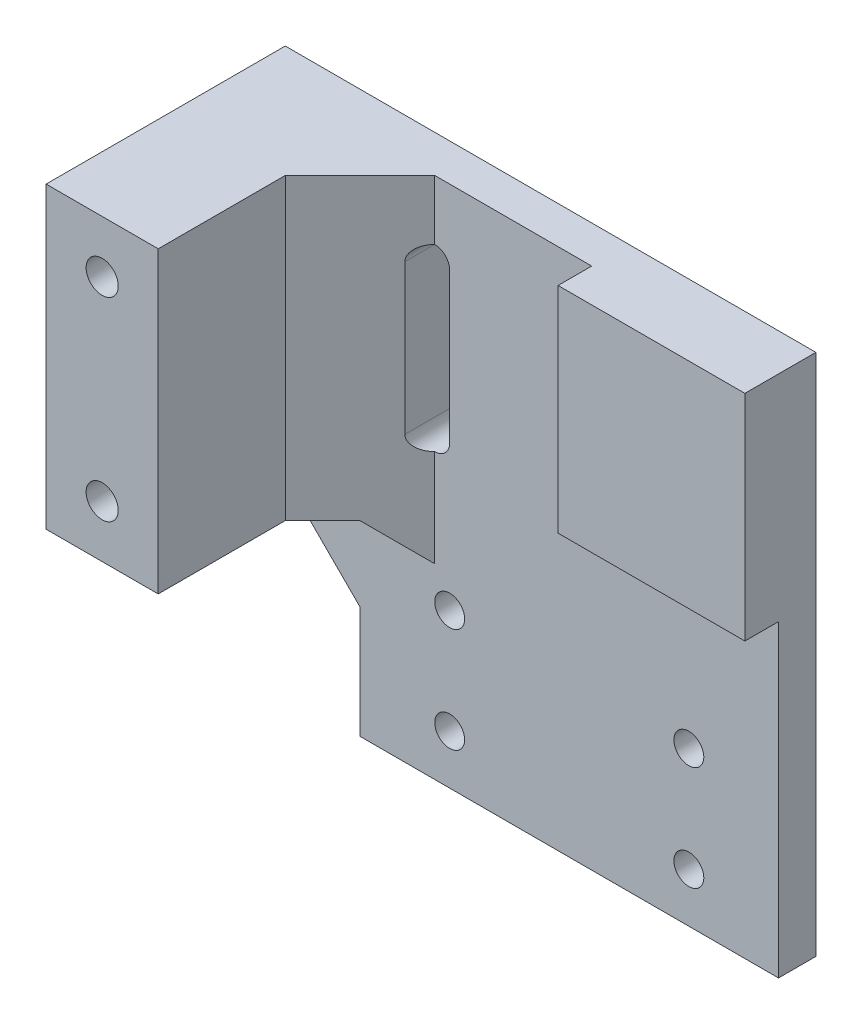
ISO-10303-21;
HEADER;
FILE_DESCRIPTION(('STEP AP214'),'2;1');
FILE_NAME('part.step','',(''),(''),'','','');
FILE_SCHEMA(('AUTOMOTIVE_DESIGN { 1 0 10303 214 1 1 1 1 }'));
ENDSEC;
DATA;
#1=APPLICATION_CONTEXT('core data for automotive mechanical design processes');
#2=APPLICATION_PROTOCOL_DEFINITION('international standard','automotive_design',2000,#1);
#3=PRODUCT_CONTEXT('',#1,'mechanical');
#4=PRODUCT('Part','Part','',(#3));
#5=PRODUCT_RELATED_PRODUCT_CATEGORY('part','',(#4));
#6=PRODUCT_DEFINITION_FORMATION('','',#4);
#7=PRODUCT_DEFINITION_CONTEXT('part definition',#1,'design');
#8=PRODUCT_DEFINITION('design','',#6,#7);
#9=PRODUCT_DEFINITION_SHAPE('','',#8);
#10=(LENGTH_UNIT() NAMED_UNIT(*) SI_UNIT(.MILLI.,.METRE.));
#11=(NAMED_UNIT(*) PLANE_ANGLE_UNIT() SI_UNIT($,.RADIAN.));
#12=(NAMED_UNIT(*) SI_UNIT($,.STERADIAN.) SOLID_ANGLE_UNIT());
#13=UNCERTAINTY_MEASURE_WITH_UNIT(LENGTH_MEASURE(1.E-05),#10,'distance_accuracy_value','');
#14=(GEOMETRIC_REPRESENTATION_CONTEXT(3) GLOBAL_UNCERTAINTY_ASSIGNED_CONTEXT((#13)) GLOBAL_UNIT_ASSIGNED_CONTEXT((#10,
#11,#12)) REPRESENTATION_CONTEXT('',''));
#15=CARTESIAN_POINT('',(0.,0.,0.));
#16=DIRECTION('',(0.,0.,1.));
#17=DIRECTION('',(1.,0.,0.));
#18=AXIS2_PLACEMENT_3D('',#15,#16,#17);
#19=CARTESIAN_POINT('',(-28.,-35.,5.));
#20=DIRECTION('',(1.,0.,0.));
#21=DIRECTION('',(0.,0.,-1.));
#22=AXIS2_PLACEMENT_3D('',#19,#20,#21);
#23=PLANE('',#22);
#24=DIRECTION('',(0.,-1.,0.));
#25=VECTOR('',#24,1.);
#26=CARTESIAN_POINT('',(-28.,-35.,5.));
#27=LINE('',#26,#25);
#28=CARTESIAN_POINT('',(-28.,-20.,5.));
#29=VERTEX_POINT('',#28);
#30=CARTESIAN_POINT('',(-28.,-35.,5.));
#31=VERTEX_POINT('',#30);
#32=EDGE_CURVE('E298',#29,#31,#27,.T.);
#33=ORIENTED_EDGE('',*,*,#32,.F.);
#34=DIRECTION('',(0.,0.,-1.));
#35=VECTOR('',#34,1.);
#36=CARTESIAN_POINT('',(-28.,-20.,0.));
#37=LINE('',#36,#35);
#38=CARTESIAN_POINT('',(-28.,-20.,0.));
#39=VERTEX_POINT('',#38);
#40=EDGE_CURVE('E341',#29,#39,#37,.T.);
#41=ORIENTED_EDGE('',*,*,#40,.T.);
#42=DIRECTION('',(0.,-1.,0.));
#43=VECTOR('',#42,1.);
#44=CARTESIAN_POINT('',(-28.,-35.,0.));
#45=LINE('',#44,#43);
#46=CARTESIAN_POINT('',(-28.,-35.,0.));
#47=VERTEX_POINT('',#46);
#48=EDGE_CURVE('E307',#39,#47,#45,.T.);
#49=ORIENTED_EDGE('',*,*,#48,.T.);
#50=DIRECTION('',(0.,0.,-1.));
#51=VECTOR('',#50,1.);
#52=CARTESIAN_POINT('',(-28.,-35.,5.));
#53=LINE('',#52,#51);
#54=EDGE_CURVE('E312',#31,#47,#53,.T.);
#55=ORIENTED_EDGE('',*,*,#54,.F.);
#56=EDGE_LOOP('',(#33,#41,#49,#55));
#57=FACE_BOUND('',#56,.T.);
#58=ADVANCED_FACE('F43',(#57),#23,.F.);
#59=CARTESIAN_POINT('',(0.,0.,5.));
#60=DIRECTION('',(0.,0.,-1.));
#61=DIRECTION('',(-1.,0.,0.));
#62=AXIS2_PLACEMENT_3D('',#59,#60,#61);
#63=PLANE('',#62);
#64=DIRECTION('',(0.,-1.,0.));
#65=VECTOR('',#64,1.);
#66=CARTESIAN_POINT('',(-17.9999999999998,-4.99999999999998,5.));
#67=LINE('',#66,#65);
#68=CARTESIAN_POINT('',(-17.9999999999998,3.,5.));
#69=VERTEX_POINT('',#68);
#70=CARTESIAN_POINT('',(-17.9999999999998,-10.,5.));
#71=VERTEX_POINT('',#70);
#72=EDGE_CURVE('E325',#69,#71,#67,.T.);
#73=ORIENTED_EDGE('',*,*,#72,.T.);
#74=DIRECTION('',(-1.,0.,0.));
#75=VECTOR('',#74,1.);
#76=CARTESIAN_POINT('',(-43.,-10.,5.));
#77=LINE('',#76,#75);
#78=CARTESIAN_POINT('',(-38.,-10.,5.));
#79=VERTEX_POINT('',#78);
#80=EDGE_CURVE('E347',#71,#79,#77,.T.);
#81=ORIENTED_EDGE('',*,*,#80,.T.);
#82=DIRECTION('',(-0.707106781186551,0.707106781186544,0.));
#83=VECTOR('',#82,1.);
#84=CARTESIAN_POINT('',(-23.9999999999998,-24.0000000000001,5.));
#85=LINE('',#84,#83);
#86=EDGE_CURVE('E343',#79,#29,#85,.F.);
#87=ORIENTED_EDGE('',*,*,#86,.T.);
#88=ORIENTED_EDGE('',*,*,#32,.T.);
#89=DIRECTION('',(1.,0.,0.));
#90=VECTOR('',#89,1.);
#91=CARTESIAN_POINT('',(-28.,-35.,5.));
#92=LINE('',#91,#90);
#93=CARTESIAN_POINT('',(28.,-35.,5.));
#94=VERTEX_POINT('',#93);
#95=EDGE_CURVE('E300',#31,#94,#92,.T.);
#96=ORIENTED_EDGE('',*,*,#95,.T.);
#97=DIRECTION('',(0.,1.,0.));
#98=VECTOR('',#97,1.);
#99=CARTESIAN_POINT('',(28.,-35.,5.));
#100=LINE('',#99,#98);
#101=CARTESIAN_POINT('',(28.,6.30000000000001,5.));
#102=VERTEX_POINT('',#101);
#103=EDGE_CURVE('E293',#94,#102,#100,.T.);
#104=ORIENTED_EDGE('',*,*,#103,.T.);
#105=DIRECTION('',(1.,0.,0.));
#106=VECTOR('',#105,1.);
#107=CARTESIAN_POINT('',(3.00000000000001,6.30000000000001,5.));
#108=LINE('',#107,#106);
#109=CARTESIAN_POINT('',(3.00000000000001,6.30000000000001,5.));
#110=VERTEX_POINT('',#109);
#111=EDGE_CURVE('E248',#110,#102,#108,.T.);
#112=ORIENTED_EDGE('',*,*,#111,.F.);
#113=DIRECTION('',(0.,-1.,0.));
#114=VECTOR('',#113,1.);
#115=CARTESIAN_POINT('',(3.00000000000001,35.,5.));
#116=LINE('',#115,#114);
#117=CARTESIAN_POINT('',(3.00000000000001,35.,5.));
#118=VERTEX_POINT('',#117);
#119=EDGE_CURVE('E243',#118,#110,#116,.T.);
#120=ORIENTED_EDGE('',*,*,#119,.F.);
#121=DIRECTION('',(-1.,0.,0.));
#122=VECTOR('',#121,1.);
#123=CARTESIAN_POINT('',(-28.,35.,5.));
#124=LINE('',#123,#122);
#125=CARTESIAN_POINT('',(-17.9999999999998,35.,5.));
#126=VERTEX_POINT('',#125);
#127=EDGE_CURVE('E295',#118,#126,#124,.T.);
#128=ORIENTED_EDGE('',*,*,#127,.T.);
#129=DIRECTION('',(0.,-1.,0.));
#130=VECTOR('',#129,1.);
#131=CARTESIAN_POINT('',(-17.9999999999998,-4.99999999999998,5.));
#132=LINE('',#131,#130);
#133=CARTESIAN_POINT('',(-17.9999999999998,27.,5.));
#134=VERTEX_POINT('',#133);
#135=EDGE_CURVE('E201',#126,#134,#132,.T.);
#136=ORIENTED_EDGE('',*,*,#135,.T.);
#137=CARTESIAN_POINT('',(-18.,25.,5.));
#138=DIRECTION('',(0.,0.,1.));
#139=DIRECTION('',(1.,0.,0.));
#140=AXIS2_PLACEMENT_3D('',#137,#138,#139);
#141=CIRCLE('',#140,2.);
#142=CARTESIAN_POINT('',(-16.,25.,5.));
#143=VERTEX_POINT('',#142);
#144=EDGE_CURVE('E178',#143,#134,#141,.T.);
#145=ORIENTED_EDGE('',*,*,#144,.F.);
#146=DIRECTION('',(0.,1.,0.));
#147=VECTOR('',#146,1.);
#148=CARTESIAN_POINT('',(-16.,5.,5.));
#149=LINE('',#148,#147);
#150=CARTESIAN_POINT('',(-16.,5.,5.));
#151=VERTEX_POINT('',#150);
#152=EDGE_CURVE('E189',#151,#143,#149,.T.);
#153=ORIENTED_EDGE('',*,*,#152,.F.);
#154=CARTESIAN_POINT('',(-18.,5.,5.));
#155=DIRECTION('',(0.,0.,1.));
#156=DIRECTION('',(1.,0.,0.));
#157=AXIS2_PLACEMENT_3D('',#154,#155,#156);
#158=CIRCLE('',#157,2.);
#159=EDGE_CURVE('E194',#69,#151,#158,.T.);
#160=ORIENTED_EDGE('',*,*,#159,.F.);
#161=EDGE_LOOP('',(#73,#81,#87,#88,#96,#104,#112,#120,#128,#136,#145,#153,#160));
#162=FACE_BOUND('',#161,.T.);
#163=CARTESIAN_POINT('',(-16.,-14.4,5.));
#164=DIRECTION('',(0.,0.,1.));
#165=DIRECTION('',(1.,0.,0.));
#166=AXIS2_PLACEMENT_3D('',#163,#164,#165);
#167=CIRCLE('',#166,2.);
#168=CARTESIAN_POINT('',(-14.,-14.4,5.));
#169=VERTEX_POINT('',#168);
#170=EDGE_CURVE('E288',#169,#169,#167,.T.);
#171=ORIENTED_EDGE('',*,*,#170,.F.);
#172=EDGE_LOOP('',(#171));
#173=FACE_BOUND('',#172,.T.);
#174=CARTESIAN_POINT('',(-16.,-28.4,5.));
#175=DIRECTION('',(0.,0.,1.));
#176=DIRECTION('',(1.,0.,0.));
#177=AXIS2_PLACEMENT_3D('',#174,#175,#176);
#178=CIRCLE('',#177,2.);
#179=CARTESIAN_POINT('',(-14.,-28.4,5.));
#180=VERTEX_POINT('',#179);
#181=EDGE_CURVE('E285',#180,#180,#178,.T.);
#182=ORIENTED_EDGE('',*,*,#181,.F.);
#183=EDGE_LOOP('',(#182));
#184=FACE_BOUND('',#183,.T.);
#185=CARTESIAN_POINT('',(16.,-14.4,5.));
#186=DIRECTION('',(0.,0.,-1.));
#187=DIRECTION('',(-1.,0.,0.));
#188=AXIS2_PLACEMENT_3D('',#185,#186,#187);
#189=CIRCLE('',#188,2.);
#190=CARTESIAN_POINT('',(14.,-14.4,5.));
#191=VERTEX_POINT('',#190);
#192=EDGE_CURVE('E268',#191,#191,#189,.T.);
#193=ORIENTED_EDGE('',*,*,#192,.T.);
#194=EDGE_LOOP('',(#193));
#195=FACE_BOUND('',#194,.T.);
#196=CARTESIAN_POINT('',(16.,-28.4,5.));
#197=DIRECTION('',(0.,0.,-1.));
#198=DIRECTION('',(-1.,0.,0.));
#199=AXIS2_PLACEMENT_3D('',#196,#197,#198);
#200=CIRCLE('',#199,2.);
#201=CARTESIAN_POINT('',(14.,-28.4,5.));
#202=VERTEX_POINT('',#201);
#203=EDGE_CURVE('E273',#202,#202,#200,.T.);
#204=ORIENTED_EDGE('',*,*,#203,.T.);
#205=EDGE_LOOP('',(#204));
#206=FACE_BOUND('',#205,.T.);
#207=ADVANCED_FACE('F197',(#162,#173,#184,#195,#206),#63,.F.);
#208=CARTESIAN_POINT('',(28.,-35.,5.));
#209=DIRECTION('',(-1.,0.,0.));
#210=DIRECTION('',(0.,0.,1.));
#211=AXIS2_PLACEMENT_3D('',#208,#209,#210);
#212=PLANE('',#211);
#213=DIRECTION('',(0.,1.,0.));
#214=VECTOR('',#213,1.);
#215=CARTESIAN_POINT('',(28.,-35.,0.));
#216=LINE('',#215,#214);
#217=CARTESIAN_POINT('',(28.,-35.,0.));
#218=VERTEX_POINT('',#217);
#219=CARTESIAN_POINT('',(28.,35.,0.));
#220=VERTEX_POINT('',#219);
#221=EDGE_CURVE('E284',#218,#220,#216,.T.);
#222=ORIENTED_EDGE('',*,*,#221,.T.);
#223=DIRECTION('',(0.,0.,-1.));
#224=VECTOR('',#223,1.);
#225=CARTESIAN_POINT('',(28.,35.,5.));
#226=LINE('',#225,#224);
#227=CARTESIAN_POINT('',(28.,35.,9.5));
#228=VERTEX_POINT('',#227);
#229=EDGE_CURVE('E315',#228,#220,#226,.T.);
#230=ORIENTED_EDGE('',*,*,#229,.F.);
#231=DIRECTION('',(0.,1.,0.));
#232=VECTOR('',#231,1.);
#233=CARTESIAN_POINT('',(28.,35.,9.5));
#234=LINE('',#233,#232);
#235=CARTESIAN_POINT('',(28.,6.30000000000001,9.5));
#236=VERTEX_POINT('',#235);
#237=EDGE_CURVE('E250',#236,#228,#234,.T.);
#238=ORIENTED_EDGE('',*,*,#237,.F.);
#239=DIRECTION('',(0.,0.,-1.));
#240=VECTOR('',#239,1.);
#241=CARTESIAN_POINT('',(28.,6.30000000000001,9.5));
#242=LINE('',#241,#240);
#243=EDGE_CURVE('E262',#236,#102,#242,.T.);
#244=ORIENTED_EDGE('',*,*,#243,.T.);
#245=ORIENTED_EDGE('',*,*,#103,.F.);
#246=DIRECTION('',(0.,0.,-1.));
#247=VECTOR('',#246,1.);
#248=CARTESIAN_POINT('',(28.,-35.,5.));
#249=LINE('',#248,#247);
#250=EDGE_CURVE('E302',#94,#218,#249,.T.);
#251=ORIENTED_EDGE('',*,*,#250,.T.);
#252=EDGE_LOOP('',(#222,#230,#238,#244,#245,#251));
#253=FACE_BOUND('',#252,.T.);
#254=ADVANCED_FACE('F421',(#253),#212,.F.);
#255=CARTESIAN_POINT('',(-28.,35.,5.));
#256=DIRECTION('',(0.,-1.,0.));
#257=DIRECTION('',(0.,0.,-1.));
#258=AXIS2_PLACEMENT_3D('',#255,#256,#257);
#259=PLANE('',#258);
#260=DIRECTION('',(-1.,0.,0.));
#261=VECTOR('',#260,1.);
#262=CARTESIAN_POINT('',(-28.,35.,0.));
#263=LINE('',#262,#261);
#264=CARTESIAN_POINT('',(-43.,35.,0.));
#265=VERTEX_POINT('',#264);
#266=EDGE_CURVE('E305',#220,#265,#263,.T.);
#267=ORIENTED_EDGE('',*,*,#266,.T.);
#268=DIRECTION('',(0.,0.,-1.));
#269=VECTOR('',#268,1.);
#270=CARTESIAN_POINT('',(-43.,35.,32.));
#271=LINE('',#270,#269);
#272=CARTESIAN_POINT('',(-43.,35.,32.));
#273=VERTEX_POINT('',#272);
#274=EDGE_CURVE('E226',#273,#265,#271,.T.);
#275=ORIENTED_EDGE('',*,*,#274,.F.);
#276=DIRECTION('',(1.,0.,0.));
#277=VECTOR('',#276,1.);
#278=CARTESIAN_POINT('',(-43.,35.,32.));
#279=LINE('',#278,#277);
#280=CARTESIAN_POINT('',(-28.,35.,32.));
#281=VERTEX_POINT('',#280);
#282=EDGE_CURVE('E231',#273,#281,#279,.T.);
#283=ORIENTED_EDGE('',*,*,#282,.T.);
#284=DIRECTION('',(0.,0.,-1.));
#285=VECTOR('',#284,1.);
#286=CARTESIAN_POINT('',(-28.,35.,32.));
#287=LINE('',#286,#285);
#288=CARTESIAN_POINT('',(-28.,35.,15.0000000000001));
#289=VERTEX_POINT('',#288);
#290=EDGE_CURVE('E235',#281,#289,#287,.T.);
#291=ORIENTED_EDGE('',*,*,#290,.T.);
#292=DIRECTION('',(-0.707106781186551,0.,0.707106781186544));
#293=VECTOR('',#292,1.);
#294=CARTESIAN_POINT('',(-23.,35.,10.0000000000001));
#295=LINE('',#294,#293);
#296=EDGE_CURVE('E339',#289,#126,#295,.F.);
#297=ORIENTED_EDGE('',*,*,#296,.T.);
#298=ORIENTED_EDGE('',*,*,#127,.F.);
#299=DIRECTION('',(0.,0.,-1.));
#300=VECTOR('',#299,1.);
#301=CARTESIAN_POINT('',(3.00000000000001,35.,9.5));
#302=LINE('',#301,#300);
#303=CARTESIAN_POINT('',(3.00000000000001,35.,9.5));
#304=VERTEX_POINT('',#303);
#305=EDGE_CURVE('E255',#304,#118,#302,.T.);
#306=ORIENTED_EDGE('',*,*,#305,.F.);
#307=DIRECTION('',(-1.,0.,0.));
#308=VECTOR('',#307,1.);
#309=CARTESIAN_POINT('',(3.00000000000001,35.,9.5));
#310=LINE('',#309,#308);
#311=EDGE_CURVE('E253',#228,#304,#310,.T.);
#312=ORIENTED_EDGE('',*,*,#311,.F.);
#313=ORIENTED_EDGE('',*,*,#229,.T.);
#314=EDGE_LOOP('',(#267,#275,#283,#291,#297,#298,#306,#312,#313));
#315=FACE_BOUND('',#314,.T.);
#316=ADVANCED_FACE('F380',(#315),#259,.F.);
#317=CARTESIAN_POINT('',(-28.,-35.,5.));
#318=DIRECTION('',(0.,1.,0.));
#319=DIRECTION('',(0.,0.,1.));
#320=AXIS2_PLACEMENT_3D('',#317,#318,#319);
#321=PLANE('',#320);
#322=DIRECTION('',(1.,0.,0.));
#323=VECTOR('',#322,1.);
#324=CARTESIAN_POINT('',(-28.,-35.,0.));
#325=LINE('',#324,#323);
#326=EDGE_CURVE('E296',#47,#218,#325,.T.);
#327=ORIENTED_EDGE('',*,*,#326,.T.);
#328=ORIENTED_EDGE('',*,*,#250,.F.);
#329=ORIENTED_EDGE('',*,*,#95,.F.);
#330=ORIENTED_EDGE('',*,*,#54,.T.);
#331=EDGE_LOOP('',(#327,#328,#329,#330));
#332=FACE_BOUND('',#331,.T.);
#333=ADVANCED_FACE('F404',(#332),#321,.F.);
#334=CARTESIAN_POINT('',(0.,0.,0.));
#335=DIRECTION('',(0.,0.,-1.));
#336=DIRECTION('',(-1.,0.,0.));
#337=AXIS2_PLACEMENT_3D('',#334,#335,#336);
#338=PLANE('',#337);
#339=CARTESIAN_POINT('',(-18.,5.,0.));
#340=DIRECTION('',(0.,0.,-1.));
#341=DIRECTION('',(-1.,0.,0.));
#342=AXIS2_PLACEMENT_3D('',#339,#340,#341);
#343=CIRCLE('',#342,2.);
#344=CARTESIAN_POINT('',(-16.,5.,0.));
#345=VERTEX_POINT('',#344);
#346=CARTESIAN_POINT('',(-20.,5.,0.));
#347=VERTEX_POINT('',#346);
#348=EDGE_CURVE('E323',#345,#347,#343,.T.);
#349=ORIENTED_EDGE('',*,*,#348,.F.);
#350=DIRECTION('',(0.,-1.,0.));
#351=VECTOR('',#350,1.);
#352=CARTESIAN_POINT('',(-16.,0.,0.));
#353=LINE('',#352,#351);
#354=CARTESIAN_POINT('',(-16.,25.,0.));
#355=VERTEX_POINT('',#354);
#356=EDGE_CURVE('E318',#355,#345,#353,.T.);
#357=ORIENTED_EDGE('',*,*,#356,.F.);
#358=CARTESIAN_POINT('',(-18.,25.,0.));
#359=DIRECTION('',(0.,0.,-1.));
#360=DIRECTION('',(-1.,0.,0.));
#361=AXIS2_PLACEMENT_3D('',#358,#359,#360);
#362=CIRCLE('',#361,2.);
#363=CARTESIAN_POINT('',(-20.,25.,0.));
#364=VERTEX_POINT('',#363);
#365=EDGE_CURVE('E181',#364,#355,#362,.T.);
#366=ORIENTED_EDGE('',*,*,#365,.F.);
#367=DIRECTION('',(0.,1.,0.));
#368=VECTOR('',#367,1.);
#369=CARTESIAN_POINT('',(-20.,0.,0.));
#370=LINE('',#369,#368);
#371=EDGE_CURVE('E321',#347,#364,#370,.T.);
#372=ORIENTED_EDGE('',*,*,#371,.F.);
#373=EDGE_LOOP('',(#349,#357,#366,#372));
#374=FACE_BOUND('',#373,.T.);
#375=CARTESIAN_POINT('',(16.,-28.4,0.));
#376=DIRECTION('',(0.,0.,-1.));
#377=DIRECTION('',(-1.,0.,0.));
#378=AXIS2_PLACEMENT_3D('',#375,#376,#377);
#379=CIRCLE('',#378,2.);
#380=CARTESIAN_POINT('',(14.,-28.4,0.));
#381=VERTEX_POINT('',#380);
#382=EDGE_CURVE('E269',#381,#381,#379,.T.);
#383=ORIENTED_EDGE('',*,*,#382,.F.);
#384=EDGE_LOOP('',(#383));
#385=FACE_BOUND('',#384,.T.);
#386=CARTESIAN_POINT('',(16.,-14.4,0.));
#387=DIRECTION('',(0.,0.,-1.));
#388=DIRECTION('',(-1.,0.,0.));
#389=AXIS2_PLACEMENT_3D('',#386,#387,#388);
#390=CIRCLE('',#389,2.);
#391=CARTESIAN_POINT('',(14.,-14.4,0.));
#392=VERTEX_POINT('',#391);
#393=EDGE_CURVE('E276',#392,#392,#390,.T.);
#394=ORIENTED_EDGE('',*,*,#393,.F.);
#395=EDGE_LOOP('',(#394));
#396=FACE_BOUND('',#395,.T.);
#397=CARTESIAN_POINT('',(-16.,-28.4,0.));
#398=DIRECTION('',(0.,0.,1.));
#399=DIRECTION('',(1.,0.,0.));
#400=AXIS2_PLACEMENT_3D('',#397,#398,#399);
#401=CIRCLE('',#400,2.);
#402=CARTESIAN_POINT('',(-14.,-28.4,0.));
#403=VERTEX_POINT('',#402);
#404=EDGE_CURVE('E281',#403,#403,#401,.T.);
#405=ORIENTED_EDGE('',*,*,#404,.T.);
#406=EDGE_LOOP('',(#405));
#407=FACE_BOUND('',#406,.T.);
#408=CARTESIAN_POINT('',(-16.,-14.4,0.));
#409=DIRECTION('',(0.,0.,1.));
#410=DIRECTION('',(1.,0.,0.));
#411=AXIS2_PLACEMENT_3D('',#408,#409,#410);
#412=CIRCLE('',#411,2.);
#413=CARTESIAN_POINT('',(-14.,-14.4,0.));
#414=VERTEX_POINT('',#413);
#415=EDGE_CURVE('E272',#414,#414,#412,.T.);
#416=ORIENTED_EDGE('',*,*,#415,.T.);
#417=EDGE_LOOP('',(#416));
#418=FACE_BOUND('',#417,.T.);
#419=ORIENTED_EDGE('',*,*,#221,.F.);
#420=ORIENTED_EDGE('',*,*,#326,.F.);
#421=ORIENTED_EDGE('',*,*,#48,.F.);
#422=DIRECTION('',(0.707106781186551,-0.707106781186544,0.));
#423=VECTOR('',#422,1.);
#424=CARTESIAN_POINT('',(-43.0000000000001,-4.99999999999998,0.));
#425=LINE('',#424,#423);
#426=CARTESIAN_POINT('',(-43.,-4.99999999999998,0.));
#427=VERTEX_POINT('',#426);
#428=EDGE_CURVE('E345',#39,#427,#425,.F.);
#429=ORIENTED_EDGE('',*,*,#428,.T.);
#430=DIRECTION('',(0.,-1.,0.));
#431=VECTOR('',#430,1.);
#432=CARTESIAN_POINT('',(-43.,-4.99999999999998,0.));
#433=LINE('',#432,#431);
#434=EDGE_CURVE('E229',#265,#427,#433,.T.);
#435=ORIENTED_EDGE('',*,*,#434,.F.);
#436=ORIENTED_EDGE('',*,*,#266,.F.);
#437=EDGE_LOOP('',(#419,#420,#421,#429,#435,#436));
#438=FACE_BOUND('',#437,.T.);
#439=ADVANCED_FACE('F384',(#374,#385,#396,#407,#418,#438),#338,.T.);
#440=CARTESIAN_POINT('',(-16.,-14.4,0.));
#441=DIRECTION('',(0.,0.,1.));
#442=DIRECTION('',(1.,0.,0.));
#443=AXIS2_PLACEMENT_3D('',#440,#441,#442);
#444=CYLINDRICAL_SURFACE('',#443,2.);
#445=ORIENTED_EDGE('',*,*,#415,.F.);
#446=EDGE_LOOP('',(#445));
#447=FACE_BOUND('',#446,.T.);
#448=ORIENTED_EDGE('',*,*,#170,.T.);
#449=EDGE_LOOP('',(#448));
#450=FACE_BOUND('',#449,.T.);
#451=ADVANCED_FACE('F403',(#447,#450),#444,.F.);
#452=CARTESIAN_POINT('',(-16.,-28.4,0.));
#453=DIRECTION('',(0.,0.,1.));
#454=DIRECTION('',(1.,0.,0.));
#455=AXIS2_PLACEMENT_3D('',#452,#453,#454);
#456=CYLINDRICAL_SURFACE('',#455,2.);
#457=ORIENTED_EDGE('',*,*,#404,.F.);
#458=EDGE_LOOP('',(#457));
#459=FACE_BOUND('',#458,.T.);
#460=ORIENTED_EDGE('',*,*,#181,.T.);
#461=EDGE_LOOP('',(#460));
#462=FACE_BOUND('',#461,.T.);
#463=ADVANCED_FACE('F416',(#459,#462),#456,.F.);
#464=CARTESIAN_POINT('',(16.,-14.4,0.));
#465=DIRECTION('',(0.,0.,1.));
#466=DIRECTION('',(1.,0.,0.));
#467=AXIS2_PLACEMENT_3D('',#464,#465,#466);
#468=CYLINDRICAL_SURFACE('',#467,2.);
#469=ORIENTED_EDGE('',*,*,#393,.T.);
#470=EDGE_LOOP('',(#469));
#471=FACE_BOUND('',#470,.T.);
#472=ORIENTED_EDGE('',*,*,#192,.F.);
#473=EDGE_LOOP('',(#472));
#474=FACE_BOUND('',#473,.T.);
#475=ADVANCED_FACE('F432',(#471,#474),#468,.F.);
#476=CARTESIAN_POINT('',(16.,-28.4,0.));
#477=DIRECTION('',(0.,0.,1.));
#478=DIRECTION('',(1.,0.,0.));
#479=AXIS2_PLACEMENT_3D('',#476,#477,#478);
#480=CYLINDRICAL_SURFACE('',#479,2.);
#481=ORIENTED_EDGE('',*,*,#382,.T.);
#482=EDGE_LOOP('',(#481));
#483=FACE_BOUND('',#482,.T.);
#484=ORIENTED_EDGE('',*,*,#203,.F.);
#485=EDGE_LOOP('',(#484));
#486=FACE_BOUND('',#485,.T.);
#487=ADVANCED_FACE('F429',(#483,#486),#480,.F.);
#488=CARTESIAN_POINT('',(3.00000000000001,35.,9.5));
#489=DIRECTION('',(1.,0.,0.));
#490=DIRECTION('',(0.,1.,0.));
#491=AXIS2_PLACEMENT_3D('',#488,#489,#490);
#492=PLANE('',#491);
#493=ORIENTED_EDGE('',*,*,#119,.T.);
#494=DIRECTION('',(0.,0.,-1.));
#495=VECTOR('',#494,1.);
#496=CARTESIAN_POINT('',(3.00000000000001,6.30000000000001,9.5));
#497=LINE('',#496,#495);
#498=CARTESIAN_POINT('',(3.00000000000001,6.30000000000001,9.5));
#499=VERTEX_POINT('',#498);
#500=EDGE_CURVE('E265',#499,#110,#497,.T.);
#501=ORIENTED_EDGE('',*,*,#500,.F.);
#502=DIRECTION('',(0.,-1.,0.));
#503=VECTOR('',#502,1.);
#504=CARTESIAN_POINT('',(3.00000000000001,35.,9.5));
#505=LINE('',#504,#503);
#506=EDGE_CURVE('E244',#304,#499,#505,.T.);
#507=ORIENTED_EDGE('',*,*,#506,.F.);
#508=ORIENTED_EDGE('',*,*,#305,.T.);
#509=EDGE_LOOP('',(#493,#501,#507,#508));
#510=FACE_BOUND('',#509,.T.);
#511=ADVANCED_FACE('F431',(#510),#492,.F.);
#512=CARTESIAN_POINT('',(3.00000000000001,6.30000000000001,9.5));
#513=DIRECTION('',(0.,1.,0.));
#514=DIRECTION('',(0.,0.,1.));
#515=AXIS2_PLACEMENT_3D('',#512,#513,#514);
#516=PLANE('',#515);
#517=ORIENTED_EDGE('',*,*,#111,.T.);
#518=ORIENTED_EDGE('',*,*,#243,.F.);
#519=DIRECTION('',(1.,0.,0.));
#520=VECTOR('',#519,1.);
#521=CARTESIAN_POINT('',(3.00000000000001,6.30000000000001,9.5));
#522=LINE('',#521,#520);
#523=EDGE_CURVE('E247',#499,#236,#522,.T.);
#524=ORIENTED_EDGE('',*,*,#523,.F.);
#525=ORIENTED_EDGE('',*,*,#500,.T.);
#526=EDGE_LOOP('',(#517,#518,#524,#525));
#527=FACE_BOUND('',#526,.T.);
#528=ADVANCED_FACE('F440',(#527),#516,.F.);
#529=CARTESIAN_POINT('',(0.,0.,9.5));
#530=DIRECTION('',(0.,0.,1.));
#531=DIRECTION('',(1.,0.,0.));
#532=AXIS2_PLACEMENT_3D('',#529,#530,#531);
#533=PLANE('',#532);
#534=ORIENTED_EDGE('',*,*,#506,.T.);
#535=ORIENTED_EDGE('',*,*,#523,.T.);
#536=ORIENTED_EDGE('',*,*,#237,.T.);
#537=ORIENTED_EDGE('',*,*,#311,.T.);
#538=EDGE_LOOP('',(#534,#535,#536,#537));
#539=FACE_BOUND('',#538,.T.);
#540=ADVANCED_FACE('F586',(#539),#533,.T.);
#541=CARTESIAN_POINT('',(-43.,-4.99999999999998,0.));
#542=DIRECTION('',(0.,1.,0.));
#543=DIRECTION('',(0.,0.,1.));
#544=AXIS2_PLACEMENT_3D('',#541,#542,#543);
#545=PLANE('',#544);
#546=DIRECTION('',(0.,0.,1.));
#547=VECTOR('',#546,1.);
#548=CARTESIAN_POINT('',(-43.,-4.99999999999998,0.));
#549=LINE('',#548,#547);
#550=CARTESIAN_POINT('',(-43.,-4.99999999999998,9.99999999999998));
#551=VERTEX_POINT('',#550);
#552=CARTESIAN_POINT('',(-43.,-4.99999999999998,32.));
#553=VERTEX_POINT('',#552);
#554=EDGE_CURVE('E224',#551,#553,#549,.T.);
#555=ORIENTED_EDGE('',*,*,#554,.F.);
#556=DIRECTION('',(1.,0.,0.));
#557=VECTOR('',#556,1.);
#558=CARTESIAN_POINT('',(-17.9999999999998,-4.99999999999998,9.99999999999998));
#559=LINE('',#558,#557);
#560=CARTESIAN_POINT('',(-22.9999999999998,-4.99999999999998,9.99999999999998));
#561=VERTEX_POINT('',#560);
#562=EDGE_CURVE('E66',#551,#561,#559,.T.);
#563=ORIENTED_EDGE('',*,*,#562,.T.);
#564=DIRECTION('',(0.707106781186551,0.,-0.707106781186544));
#565=VECTOR('',#564,1.);
#566=CARTESIAN_POINT('',(-28.,-4.99999999999998,15.0000000000001));
#567=LINE('',#566,#565);
#568=CARTESIAN_POINT('',(-28.,-4.99999999999998,15.0000000000001));
#569=VERTEX_POINT('',#568);
#570=EDGE_CURVE('E337',#561,#569,#567,.F.);
#571=ORIENTED_EDGE('',*,*,#570,.T.);
#572=DIRECTION('',(0.,0.,1.));
#573=VECTOR('',#572,1.);
#574=CARTESIAN_POINT('',(-28.,-4.99999999999998,0.));
#575=LINE('',#574,#573);
#576=CARTESIAN_POINT('',(-28.,-4.99999999999998,32.));
#577=VERTEX_POINT('',#576);
#578=EDGE_CURVE('E213',#569,#577,#575,.T.);
#579=ORIENTED_EDGE('',*,*,#578,.T.);
#580=DIRECTION('',(1.,0.,0.));
#581=VECTOR('',#580,1.);
#582=CARTESIAN_POINT('',(-43.,-4.99999999999998,32.));
#583=LINE('',#582,#581);
#584=EDGE_CURVE('E240',#553,#577,#583,.T.);
#585=ORIENTED_EDGE('',*,*,#584,.F.);
#586=EDGE_LOOP('',(#555,#563,#571,#579,#585));
#587=FACE_BOUND('',#586,.T.);
#588=ADVANCED_FACE('F366',(#587),#545,.F.);
#589=CARTESIAN_POINT('',(-43.,-4.99999999999998,32.));
#590=DIRECTION('',(0.,0.,-1.));
#591=DIRECTION('',(0.,1.,0.));
#592=AXIS2_PLACEMENT_3D('',#589,#590,#591);
#593=PLANE('',#592);
#594=CARTESIAN_POINT('',(-35.5,28.,32.));
#595=DIRECTION('',(0.,0.,1.));
#596=DIRECTION('',(1.,0.,0.));
#597=AXIS2_PLACEMENT_3D('',#594,#595,#596);
#598=CIRCLE('',#597,2.15);
#599=CARTESIAN_POINT('',(-33.35,28.,32.));
#600=VERTEX_POINT('',#599);
#601=EDGE_CURVE('E214',#600,#600,#598,.T.);
#602=ORIENTED_EDGE('',*,*,#601,.F.);
#603=EDGE_LOOP('',(#602));
#604=FACE_BOUND('',#603,.T.);
#605=CARTESIAN_POINT('',(-35.5,2.00000000000002,32.));
#606=DIRECTION('',(0.,0.,1.));
#607=DIRECTION('',(-1.,0.,0.));
#608=AXIS2_PLACEMENT_3D('',#605,#606,#607);
#609=CIRCLE('',#608,2.15);
#610=CARTESIAN_POINT('',(-37.65,2.00000000000002,32.));
#611=VERTEX_POINT('',#610);
#612=EDGE_CURVE('E217',#611,#611,#609,.T.);
#613=ORIENTED_EDGE('',*,*,#612,.F.);
#614=EDGE_LOOP('',(#613));
#615=FACE_BOUND('',#614,.T.);
#616=DIRECTION('',(0.,1.,0.));
#617=VECTOR('',#616,1.);
#618=CARTESIAN_POINT('',(-28.,-4.99999999999998,32.));
#619=LINE('',#618,#617);
#620=EDGE_CURVE('E233',#577,#281,#619,.T.);
#621=ORIENTED_EDGE('',*,*,#620,.T.);
#622=ORIENTED_EDGE('',*,*,#282,.F.);
#623=DIRECTION('',(0.,1.,0.));
#624=VECTOR('',#623,1.);
#625=CARTESIAN_POINT('',(-43.,-4.99999999999998,32.));
#626=LINE('',#625,#624);
#627=EDGE_CURVE('E223',#553,#273,#626,.T.);
#628=ORIENTED_EDGE('',*,*,#627,.F.);
#629=ORIENTED_EDGE('',*,*,#584,.T.);
#630=EDGE_LOOP('',(#621,#622,#628,#629));
#631=FACE_BOUND('',#630,.T.);
#632=ADVANCED_FACE('F375',(#604,#615,#631),#593,.F.);
#633=CARTESIAN_POINT('',(-43.,0.,0.));
#634=DIRECTION('',(-1.,0.,0.));
#635=DIRECTION('',(0.,0.,1.));
#636=AXIS2_PLACEMENT_3D('',#633,#634,#635);
#637=PLANE('',#636);
#638=EDGE_CURVE('E59',#427,#551,#549,.T.);
#639=ORIENTED_EDGE('',*,*,#638,.T.);
#640=ORIENTED_EDGE('',*,*,#554,.T.);
#641=ORIENTED_EDGE('',*,*,#627,.T.);
#642=ORIENTED_EDGE('',*,*,#274,.T.);
#643=ORIENTED_EDGE('',*,*,#434,.T.);
#644=EDGE_LOOP('',(#639,#640,#641,#642,#643));
#645=FACE_BOUND('',#644,.T.);
#646=ADVANCED_FACE('F376',(#645),#637,.T.);
#647=CARTESIAN_POINT('',(-28.,0.,0.));
#648=DIRECTION('',(-1.,0.,0.));
#649=DIRECTION('',(0.,0.,1.));
#650=AXIS2_PLACEMENT_3D('',#647,#648,#649);
#651=PLANE('',#650);
#652=ORIENTED_EDGE('',*,*,#578,.F.);
#653=DIRECTION('',(0.,1.,0.));
#654=VECTOR('',#653,1.);
#655=CARTESIAN_POINT('',(-28.,35.,15.0000000000001));
#656=LINE('',#655,#654);
#657=EDGE_CURVE('E328',#569,#289,#656,.T.);
#658=ORIENTED_EDGE('',*,*,#657,.T.);
#659=ORIENTED_EDGE('',*,*,#290,.F.);
#660=ORIENTED_EDGE('',*,*,#620,.F.);
#661=EDGE_LOOP('',(#652,#658,#659,#660));
#662=FACE_BOUND('',#661,.T.);
#663=ADVANCED_FACE('F370',(#662),#651,.F.);
#664=CARTESIAN_POINT('',(-35.5,2.00000000000002,22.));
#665=DIRECTION('',(0.,0.,1.));
#666=DIRECTION('',(1.,0.,0.));
#667=AXIS2_PLACEMENT_3D('',#664,#665,#666);
#668=CYLINDRICAL_SURFACE('',#667,2.15);
#669=CARTESIAN_POINT('',(-35.5,2.00000000000002,22.));
#670=DIRECTION('',(0.,0.,1.));
#671=DIRECTION('',(-1.,0.,0.));
#672=AXIS2_PLACEMENT_3D('',#669,#670,#671);
#673=CIRCLE('',#672,2.15);
#674=CARTESIAN_POINT('',(-37.65,2.00000000000002,22.));
#675=VERTEX_POINT('',#674);
#676=EDGE_CURVE('E208',#675,#675,#673,.T.);
#677=ORIENTED_EDGE('',*,*,#676,.F.);
#678=EDGE_LOOP('',(#677));
#679=FACE_BOUND('',#678,.T.);
#680=ORIENTED_EDGE('',*,*,#612,.T.);
#681=EDGE_LOOP('',(#680));
#682=FACE_BOUND('',#681,.T.);
#683=ADVANCED_FACE('F543',(#679,#682),#668,.F.);
#684=CARTESIAN_POINT('',(-35.5,2.00000000000002,22.));
#685=DIRECTION('',(0.,0.,-1.));
#686=DIRECTION('',(-1.,0.,0.));
#687=AXIS2_PLACEMENT_3D('',#684,#685,#686);
#688=PLANE('',#687);
#689=ORIENTED_EDGE('',*,*,#676,.T.);
#690=EDGE_LOOP('',(#689));
#691=FACE_BOUND('',#690,.T.);
#692=ADVANCED_FACE('F533',(#691),#688,.F.);
#693=CARTESIAN_POINT('',(-35.5,28.,22.));
#694=DIRECTION('',(0.,0.,1.));
#695=DIRECTION('',(1.,0.,0.));
#696=AXIS2_PLACEMENT_3D('',#693,#694,#695);
#697=CYLINDRICAL_SURFACE('',#696,2.15);
#698=CARTESIAN_POINT('',(-35.5,28.,22.));
#699=DIRECTION('',(0.,0.,1.));
#700=DIRECTION('',(1.,0.,0.));
#701=AXIS2_PLACEMENT_3D('',#698,#699,#700);
#702=CIRCLE('',#701,2.15);
#703=CARTESIAN_POINT('',(-33.35,28.,22.));
#704=VERTEX_POINT('',#703);
#705=EDGE_CURVE('E210',#704,#704,#702,.T.);
#706=ORIENTED_EDGE('',*,*,#705,.F.);
#707=EDGE_LOOP('',(#706));
#708=FACE_BOUND('',#707,.T.);
#709=ORIENTED_EDGE('',*,*,#601,.T.);
#710=EDGE_LOOP('',(#709));
#711=FACE_BOUND('',#710,.T.);
#712=ADVANCED_FACE('F523',(#708,#711),#697,.F.);
#713=CARTESIAN_POINT('',(-35.5,28.,22.));
#714=DIRECTION('',(0.,0.,1.));
#715=DIRECTION('',(1.,0.,0.));
#716=AXIS2_PLACEMENT_3D('',#713,#714,#715);
#717=PLANE('',#716);
#718=ORIENTED_EDGE('',*,*,#705,.T.);
#719=EDGE_LOOP('',(#718));
#720=FACE_BOUND('',#719,.T.);
#721=ADVANCED_FACE('F514',(#720),#717,.T.);
#722=CARTESIAN_POINT('',(-18.,5.,-5.));
#723=DIRECTION('',(0.,0.,1.));
#724=DIRECTION('',(1.,0.,0.));
#725=AXIS2_PLACEMENT_3D('',#722,#723,#724);
#726=CYLINDRICAL_SURFACE('',#725,2.);
#727=ORIENTED_EDGE('',*,*,#348,.T.);
#728=DIRECTION('',(0.,0.,1.));
#729=VECTOR('',#728,1.);
#730=CARTESIAN_POINT('',(-20.,5.,-5.));
#731=LINE('',#730,#729);
#732=CARTESIAN_POINT('',(-20.,5.,7.00000000000016));
#733=VERTEX_POINT('',#732);
#734=EDGE_CURVE('E206',#347,#733,#731,.T.);
#735=ORIENTED_EDGE('',*,*,#734,.T.);
#736=CARTESIAN_POINT('',(-18.,5.,5.00000000000018));
#737=DIRECTION('',(0.707106781186544,0.,0.707106781186551));
#738=DIRECTION('',(-0.707106781186551,0.,0.707106781186544));
#739=AXIS2_PLACEMENT_3D('',#736,#737,#738);
#740=ELLIPSE('',#739,2.82842712474618,2.);
#741=EDGE_CURVE('E335',#733,#69,#740,.T.);
#742=ORIENTED_EDGE('',*,*,#741,.T.);
#743=ORIENTED_EDGE('',*,*,#159,.T.);
#744=DIRECTION('',(0.,0.,1.));
#745=VECTOR('',#744,1.);
#746=CARTESIAN_POINT('',(-16.,5.,-5.));
#747=LINE('',#746,#745);
#748=EDGE_CURVE('E185',#345,#151,#747,.T.);
#749=ORIENTED_EDGE('',*,*,#748,.F.);
#750=EDGE_LOOP('',(#727,#735,#742,#743,#749));
#751=FACE_BOUND('',#750,.T.);
#752=ADVANCED_FACE('F393',(#751),#726,.F.);
#753=CARTESIAN_POINT('',(-20.,5.,-5.));
#754=DIRECTION('',(-1.,0.,0.));
#755=DIRECTION('',(0.,0.,1.));
#756=AXIS2_PLACEMENT_3D('',#753,#754,#755);
#757=PLANE('',#756);
#758=ORIENTED_EDGE('',*,*,#371,.T.);
#759=DIRECTION('',(0.,0.,1.));
#760=VECTOR('',#759,1.);
#761=CARTESIAN_POINT('',(-20.,25.,-5.));
#762=LINE('',#761,#760);
#763=CARTESIAN_POINT('',(-20.,25.,7.00000000000016));
#764=VERTEX_POINT('',#763);
#765=EDGE_CURVE('E184',#364,#764,#762,.T.);
#766=ORIENTED_EDGE('',*,*,#765,.T.);
#767=DIRECTION('',(0.,1.,0.));
#768=VECTOR('',#767,1.);
#769=CARTESIAN_POINT('',(-20.,5.,7.00000000000016));
#770=LINE('',#769,#768);
#771=EDGE_CURVE('E332',#764,#733,#770,.F.);
#772=ORIENTED_EDGE('',*,*,#771,.T.);
#773=ORIENTED_EDGE('',*,*,#734,.F.);
#774=EDGE_LOOP('',(#758,#766,#772,#773));
#775=FACE_BOUND('',#774,.T.);
#776=ADVANCED_FACE('F398',(#775),#757,.F.);
#777=CARTESIAN_POINT('',(-18.,25.,-5.));
#778=DIRECTION('',(0.,0.,1.));
#779=DIRECTION('',(1.,0.,0.));
#780=AXIS2_PLACEMENT_3D('',#777,#778,#779);
#781=CYLINDRICAL_SURFACE('',#780,2.);
#782=ORIENTED_EDGE('',*,*,#365,.T.);
#783=DIRECTION('',(0.,0.,1.));
#784=VECTOR('',#783,1.);
#785=CARTESIAN_POINT('',(-16.,25.,-5.));
#786=LINE('',#785,#784);
#787=EDGE_CURVE('E173',#355,#143,#786,.T.);
#788=ORIENTED_EDGE('',*,*,#787,.T.);
#789=ORIENTED_EDGE('',*,*,#144,.T.);
#790=CARTESIAN_POINT('',(-18.,25.,5.00000000000018));
#791=DIRECTION('',(0.707106781186544,0.,0.707106781186551));
#792=DIRECTION('',(-0.707106781186551,0.,0.707106781186544));
#793=AXIS2_PLACEMENT_3D('',#790,#791,#792);
#794=ELLIPSE('',#793,2.82842712474618,2.);
#795=EDGE_CURVE('E330',#134,#764,#794,.T.);
#796=ORIENTED_EDGE('',*,*,#795,.T.);
#797=ORIENTED_EDGE('',*,*,#765,.F.);
#798=EDGE_LOOP('',(#782,#788,#789,#796,#797));
#799=FACE_BOUND('',#798,.T.);
#800=ADVANCED_FACE('F175',(#799),#781,.F.);
#801=CARTESIAN_POINT('',(-16.,5.,-5.));
#802=DIRECTION('',(1.,0.,0.));
#803=DIRECTION('',(0.,0.,-1.));
#804=AXIS2_PLACEMENT_3D('',#801,#802,#803);
#805=PLANE('',#804);
#806=ORIENTED_EDGE('',*,*,#356,.T.);
#807=ORIENTED_EDGE('',*,*,#748,.T.);
#808=ORIENTED_EDGE('',*,*,#152,.T.);
#809=ORIENTED_EDGE('',*,*,#787,.F.);
#810=EDGE_LOOP('',(#806,#807,#808,#809));
#811=FACE_BOUND('',#810,.T.);
#812=ADVANCED_FACE('F190',(#811),#805,.F.);
#813=CARTESIAN_POINT('',(-17.9999999999998,0.,5.));
#814=DIRECTION('',(0.707106781186544,0.,0.707106781186551));
#815=DIRECTION('',(0.,1.,0.));
#816=AXIS2_PLACEMENT_3D('',#813,#814,#815);
#817=PLANE('',#816);
#818=ORIENTED_EDGE('',*,*,#296,.F.);
#819=ORIENTED_EDGE('',*,*,#657,.F.);
#820=ORIENTED_EDGE('',*,*,#570,.F.);
#821=DIRECTION('',(0.577350269189628,-0.577350269189628,-0.577350269189622));
#822=VECTOR('',#821,1.);
#823=CARTESIAN_POINT('',(-21.3333333333332,-6.66666666666665,8.33333333333333));
#824=LINE('',#823,#822);
#825=EDGE_CURVE('E11',#561,#71,#824,.T.);
#826=ORIENTED_EDGE('',*,*,#825,.T.);
#827=ORIENTED_EDGE('',*,*,#72,.F.);
#828=ORIENTED_EDGE('',*,*,#741,.F.);
#829=ORIENTED_EDGE('',*,*,#771,.F.);
#830=ORIENTED_EDGE('',*,*,#795,.F.);
#831=ORIENTED_EDGE('',*,*,#135,.F.);
#832=EDGE_LOOP('',(#818,#819,#820,#826,#827,#828,#829,#830,#831));
#833=FACE_BOUND('',#832,.T.);
#834=ADVANCED_FACE('F362',(#833),#817,.T.);
#835=CARTESIAN_POINT('',(-43.0000000000001,-4.99999999999998,0.));
#836=DIRECTION('',(-0.707106781186544,-0.707106781186551,0.));
#837=DIRECTION('',(0.,0.,-1.));
#838=AXIS2_PLACEMENT_3D('',#835,#836,#837);
#839=PLANE('',#838);
#840=ORIENTED_EDGE('',*,*,#428,.F.);
#841=ORIENTED_EDGE('',*,*,#40,.F.);
#842=ORIENTED_EDGE('',*,*,#86,.F.);
#843=DIRECTION('',(-0.577350269189632,0.577350269189626,0.57735026918962));
#844=VECTOR('',#843,1.);
#845=CARTESIAN_POINT('',(-39.6666666666668,-8.33333333333327,6.66666666666672));
#846=LINE('',#845,#844);
#847=EDGE_CURVE('E52',#79,#551,#846,.T.);
#848=ORIENTED_EDGE('',*,*,#847,.T.);
#849=ORIENTED_EDGE('',*,*,#638,.F.);
#850=EDGE_LOOP('',(#840,#841,#842,#848,#849));
#851=FACE_BOUND('',#850,.T.);
#852=ADVANCED_FACE('F354',(#851),#839,.T.);
#853=CARTESIAN_POINT('',(0.,-10.,5.));
#854=DIRECTION('',(0.,-0.707106781186544,0.707106781186551));
#855=DIRECTION('',(1.,0.,0.));
#856=AXIS2_PLACEMENT_3D('',#853,#854,#855);
#857=PLANE('',#856);
#858=ORIENTED_EDGE('',*,*,#825,.F.);
#859=ORIENTED_EDGE('',*,*,#562,.F.);
#860=ORIENTED_EDGE('',*,*,#847,.F.);
#861=ORIENTED_EDGE('',*,*,#80,.F.);
#862=EDGE_LOOP('',(#858,#859,#860,#861));
#863=FACE_BOUND('',#862,.T.);
#864=ADVANCED_FACE('F46',(#863),#857,.T.);
#865=CLOSED_SHELL('',(#58,#207,#254,#316,#333,#439,#451,#463,#475,#487,#511,#528,#540,#588,#632,
#646,#663,#683,#692,#712,#721,#752,#776,#800,#812,#834,#852,#864));
#866=MANIFOLD_SOLID_BREP('B2',#865);
#867=ADVANCED_BREP_SHAPE_REPRESENTATION('',(#18,#866),#14);
#868=SHAPE_DEFINITION_REPRESENTATION(#9,#867);
ENDSEC;
END-ISO-10303-21;
